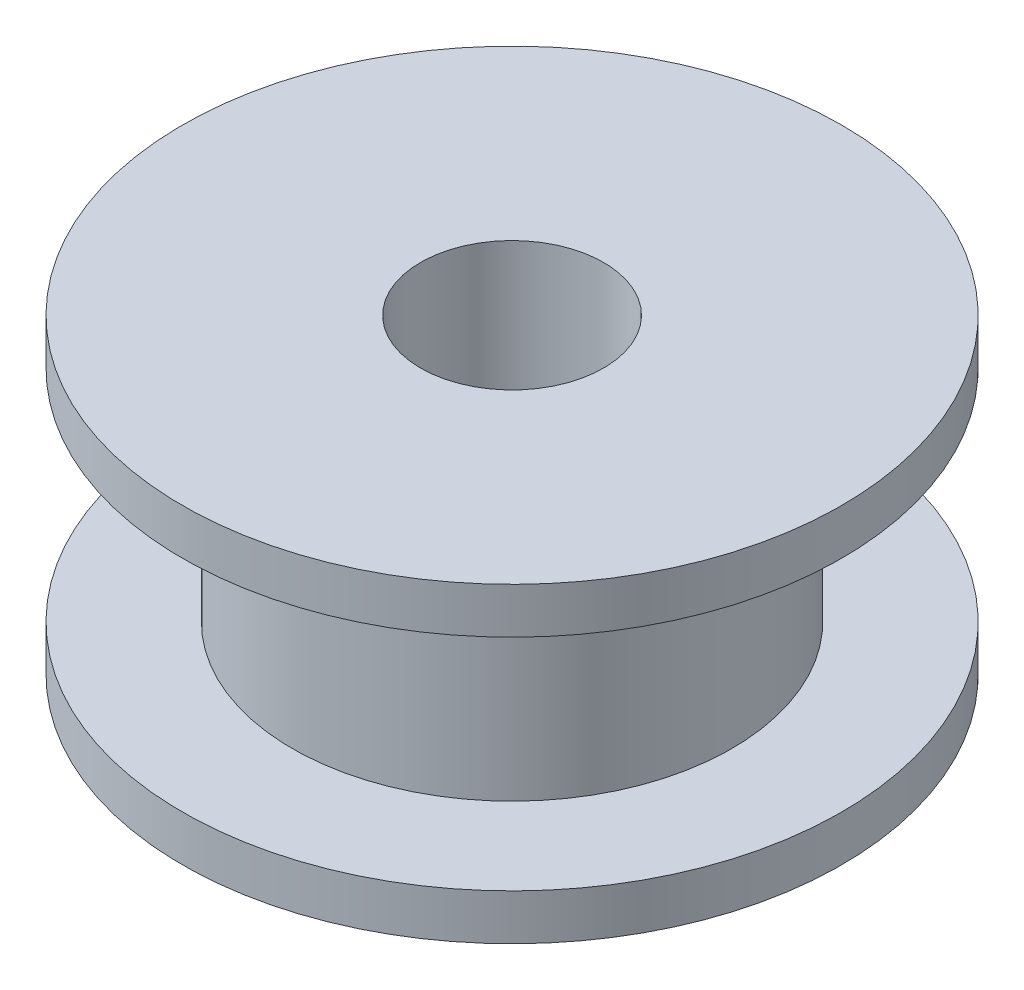
ISO-10303-21;
HEADER;
FILE_DESCRIPTION(('STEP AP214'),'2;1');
FILE_NAME('part.step','',(''),(''),'','','');
FILE_SCHEMA(('AUTOMOTIVE_DESIGN { 1 0 10303 214 1 1 1 1 }'));
ENDSEC;
DATA;
#1=APPLICATION_CONTEXT('core data for automotive mechanical design processes');
#2=APPLICATION_PROTOCOL_DEFINITION('international standard','automotive_design',2000,#1);
#3=PRODUCT_CONTEXT('',#1,'mechanical');
#4=PRODUCT('Part','Part','',(#3));
#5=PRODUCT_RELATED_PRODUCT_CATEGORY('part','',(#4));
#6=PRODUCT_DEFINITION_FORMATION('','',#4);
#7=PRODUCT_DEFINITION_CONTEXT('part definition',#1,'design');
#8=PRODUCT_DEFINITION('design','',#6,#7);
#9=PRODUCT_DEFINITION_SHAPE('','',#8);
#10=(LENGTH_UNIT() NAMED_UNIT(*) SI_UNIT(.MILLI.,.METRE.));
#11=(NAMED_UNIT(*) PLANE_ANGLE_UNIT() SI_UNIT($,.RADIAN.));
#12=(NAMED_UNIT(*) SI_UNIT($,.STERADIAN.) SOLID_ANGLE_UNIT());
#13=UNCERTAINTY_MEASURE_WITH_UNIT(LENGTH_MEASURE(1.E-05),#10,'distance_accuracy_value','');
#14=(GEOMETRIC_REPRESENTATION_CONTEXT(3) GLOBAL_UNCERTAINTY_ASSIGNED_CONTEXT((#13)) GLOBAL_UNIT_ASSIGNED_CONTEXT((#10,
#11,#12)) REPRESENTATION_CONTEXT('',''));
#15=CARTESIAN_POINT('',(0.,0.,0.));
#16=DIRECTION('',(0.,0.,1.));
#17=DIRECTION('',(1.,0.,0.));
#18=AXIS2_PLACEMENT_3D('',#15,#16,#17);
#19=CARTESIAN_POINT('',(0.,-8.5,0.));
#20=DIRECTION('',(0.,1.,0.));
#21=DIRECTION('',(0.,0.,1.));
#22=AXIS2_PLACEMENT_3D('',#19,#20,#21);
#23=PLANE('',#22);
#24=CARTESIAN_POINT('',(0.,-8.5,0.));
#25=DIRECTION('',(0.,1.,0.));
#26=DIRECTION('',(0.,0.,1.));
#27=AXIS2_PLACEMENT_3D('',#24,#25,#26);
#28=CIRCLE('',#27,2.5);
#29=CARTESIAN_POINT('',(0.,-8.5,2.5));
#30=VERTEX_POINT('',#29);
#31=EDGE_CURVE('E62',#30,#30,#28,.T.);
#32=ORIENTED_EDGE('',*,*,#31,.T.);
#33=EDGE_LOOP('',(#32));
#34=FACE_BOUND('',#33,.T.);
#35=CARTESIAN_POINT('',(0.,-8.5,0.));
#36=DIRECTION('',(0.,-1.,0.));
#37=DIRECTION('',(0.,0.,-1.));
#38=AXIS2_PLACEMENT_3D('',#35,#36,#37);
#39=CIRCLE('',#38,9.);
#40=CARTESIAN_POINT('',(0.,-8.5,-9.));
#41=VERTEX_POINT('',#40);
#42=EDGE_CURVE('E10',#41,#41,#39,.T.);
#43=ORIENTED_EDGE('',*,*,#42,.T.);
#44=EDGE_LOOP('',(#43));
#45=FACE_BOUND('',#44,.T.);
#46=ADVANCED_FACE('F37',(#34,#45),#23,.F.);
#47=CARTESIAN_POINT('',(0.,0.,0.));
#48=DIRECTION('',(0.,-1.,0.));
#49=DIRECTION('',(0.,0.,-1.));
#50=AXIS2_PLACEMENT_3D('',#47,#48,#49);
#51=CYLINDRICAL_SURFACE('',#50,9.);
#52=ORIENTED_EDGE('',*,*,#42,.F.);
#53=EDGE_LOOP('',(#52));
#54=FACE_BOUND('',#53,.T.);
#55=CARTESIAN_POINT('',(0.,-7.25,0.));
#56=DIRECTION('',(0.,-1.,0.));
#57=DIRECTION('',(0.,0.,-1.));
#58=AXIS2_PLACEMENT_3D('',#55,#56,#57);
#59=CIRCLE('',#58,9.);
#60=CARTESIAN_POINT('',(0.,-7.25,-9.));
#61=VERTEX_POINT('',#60);
#62=EDGE_CURVE('E43',#61,#61,#59,.T.);
#63=ORIENTED_EDGE('',*,*,#62,.T.);
#64=EDGE_LOOP('',(#63));
#65=FACE_BOUND('',#64,.T.);
#66=ADVANCED_FACE('F91',(#54,#65),#51,.T.);
#67=CARTESIAN_POINT('',(-9.,-7.25,0.));
#68=DIRECTION('',(0.,-1.,0.));
#69=DIRECTION('',(0.,0.,-1.));
#70=AXIS2_PLACEMENT_3D('',#67,#68,#69);
#71=PLANE('',#70);
#72=ORIENTED_EDGE('',*,*,#62,.F.);
#73=EDGE_LOOP('',(#72));
#74=FACE_BOUND('',#73,.T.);
#75=CARTESIAN_POINT('',(0.,-7.25,0.));
#76=DIRECTION('',(0.,-1.,0.));
#77=DIRECTION('',(0.,0.,-1.));
#78=AXIS2_PLACEMENT_3D('',#75,#76,#77);
#79=CIRCLE('',#78,6.);
#80=CARTESIAN_POINT('',(0.,-7.25,-6.));
#81=VERTEX_POINT('',#80);
#82=EDGE_CURVE('E47',#81,#81,#79,.T.);
#83=ORIENTED_EDGE('',*,*,#82,.T.);
#84=EDGE_LOOP('',(#83));
#85=FACE_BOUND('',#84,.T.);
#86=ADVANCED_FACE('F96',(#74,#85),#71,.F.);
#87=CARTESIAN_POINT('',(0.,0.,0.));
#88=DIRECTION('',(0.,-1.,0.));
#89=DIRECTION('',(0.,0.,-1.));
#90=AXIS2_PLACEMENT_3D('',#87,#88,#89);
#91=CYLINDRICAL_SURFACE('',#90,6.);
#92=ORIENTED_EDGE('',*,*,#82,.F.);
#93=EDGE_LOOP('',(#92));
#94=FACE_BOUND('',#93,.T.);
#95=CARTESIAN_POINT('',(0.,-1.25,0.));
#96=DIRECTION('',(0.,-1.,0.));
#97=DIRECTION('',(0.,0.,-1.));
#98=AXIS2_PLACEMENT_3D('',#95,#96,#97);
#99=CIRCLE('',#98,6.);
#100=CARTESIAN_POINT('',(0.,-1.25,-6.));
#101=VERTEX_POINT('',#100);
#102=EDGE_CURVE('E51',#101,#101,#99,.T.);
#103=ORIENTED_EDGE('',*,*,#102,.T.);
#104=EDGE_LOOP('',(#103));
#105=FACE_BOUND('',#104,.T.);
#106=ADVANCED_FACE('F87',(#94,#105),#91,.T.);
#107=CARTESIAN_POINT('',(-6.,-1.25,0.));
#108=DIRECTION('',(0.,1.,0.));
#109=DIRECTION('',(0.,0.,1.));
#110=AXIS2_PLACEMENT_3D('',#107,#108,#109);
#111=PLANE('',#110);
#112=ORIENTED_EDGE('',*,*,#102,.F.);
#113=EDGE_LOOP('',(#112));
#114=FACE_BOUND('',#113,.T.);
#115=CARTESIAN_POINT('',(0.,-1.25,0.));
#116=DIRECTION('',(0.,-1.,0.));
#117=DIRECTION('',(0.,0.,-1.));
#118=AXIS2_PLACEMENT_3D('',#115,#116,#117);
#119=CIRCLE('',#118,9.);
#120=CARTESIAN_POINT('',(0.,-1.25,-9.));
#121=VERTEX_POINT('',#120);
#122=EDGE_CURVE('E56',#121,#121,#119,.T.);
#123=ORIENTED_EDGE('',*,*,#122,.T.);
#124=EDGE_LOOP('',(#123));
#125=FACE_BOUND('',#124,.T.);
#126=ADVANCED_FACE('F80',(#114,#125),#111,.F.);
#127=CARTESIAN_POINT('',(0.,0.,0.));
#128=DIRECTION('',(0.,-1.,0.));
#129=DIRECTION('',(0.,0.,-1.));
#130=AXIS2_PLACEMENT_3D('',#127,#128,#129);
#131=CYLINDRICAL_SURFACE('',#130,9.);
#132=ORIENTED_EDGE('',*,*,#122,.F.);
#133=EDGE_LOOP('',(#132));
#134=FACE_BOUND('',#133,.T.);
#135=CARTESIAN_POINT('',(0.,0.,0.));
#136=DIRECTION('',(0.,-1.,0.));
#137=DIRECTION('',(0.,0.,-1.));
#138=AXIS2_PLACEMENT_3D('',#135,#136,#137);
#139=CIRCLE('',#138,9.);
#140=CARTESIAN_POINT('',(0.,0.,-9.));
#141=VERTEX_POINT('',#140);
#142=EDGE_CURVE('E59',#141,#141,#139,.T.);
#143=ORIENTED_EDGE('',*,*,#142,.T.);
#144=EDGE_LOOP('',(#143));
#145=FACE_BOUND('',#144,.T.);
#146=ADVANCED_FACE('F75',(#134,#145),#131,.T.);
#147=CARTESIAN_POINT('',(-9.,0.,0.));
#148=DIRECTION('',(0.,-1.,0.));
#149=DIRECTION('',(0.,0.,-1.));
#150=AXIS2_PLACEMENT_3D('',#147,#148,#149);
#151=PLANE('',#150);
#152=CARTESIAN_POINT('',(0.,0.,0.));
#153=DIRECTION('',(0.,1.,0.));
#154=DIRECTION('',(0.,0.,1.));
#155=AXIS2_PLACEMENT_3D('',#152,#153,#154);
#156=CIRCLE('',#155,2.5);
#157=CARTESIAN_POINT('',(0.,0.,2.5));
#158=VERTEX_POINT('',#157);
#159=EDGE_CURVE('E65',#158,#158,#156,.T.);
#160=ORIENTED_EDGE('',*,*,#159,.F.);
#161=EDGE_LOOP('',(#160));
#162=FACE_BOUND('',#161,.T.);
#163=ORIENTED_EDGE('',*,*,#142,.F.);
#164=EDGE_LOOP('',(#163));
#165=FACE_BOUND('',#164,.T.);
#166=ADVANCED_FACE('F72',(#162,#165),#151,.F.);
#167=CARTESIAN_POINT('',(0.,-10.,0.));
#168=DIRECTION('',(0.,1.,0.));
#169=DIRECTION('',(0.,0.,1.));
#170=AXIS2_PLACEMENT_3D('',#167,#168,#169);
#171=CYLINDRICAL_SURFACE('',#170,2.5);
#172=ORIENTED_EDGE('',*,*,#159,.T.);
#173=EDGE_LOOP('',(#172));
#174=FACE_BOUND('',#173,.T.);
#175=ORIENTED_EDGE('',*,*,#31,.F.);
#176=EDGE_LOOP('',(#175));
#177=FACE_BOUND('',#176,.T.);
#178=ADVANCED_FACE('F69',(#174,#177),#171,.F.);
#179=CLOSED_SHELL('',(#46,#66,#86,#106,#126,#146,#166,#178));
#180=MANIFOLD_SOLID_BREP('B2',#179);
#181=ADVANCED_BREP_SHAPE_REPRESENTATION('',(#18,#180),#14);
#182=SHAPE_DEFINITION_REPRESENTATION(#9,#181);
ENDSEC;
END-ISO-10303-21;
